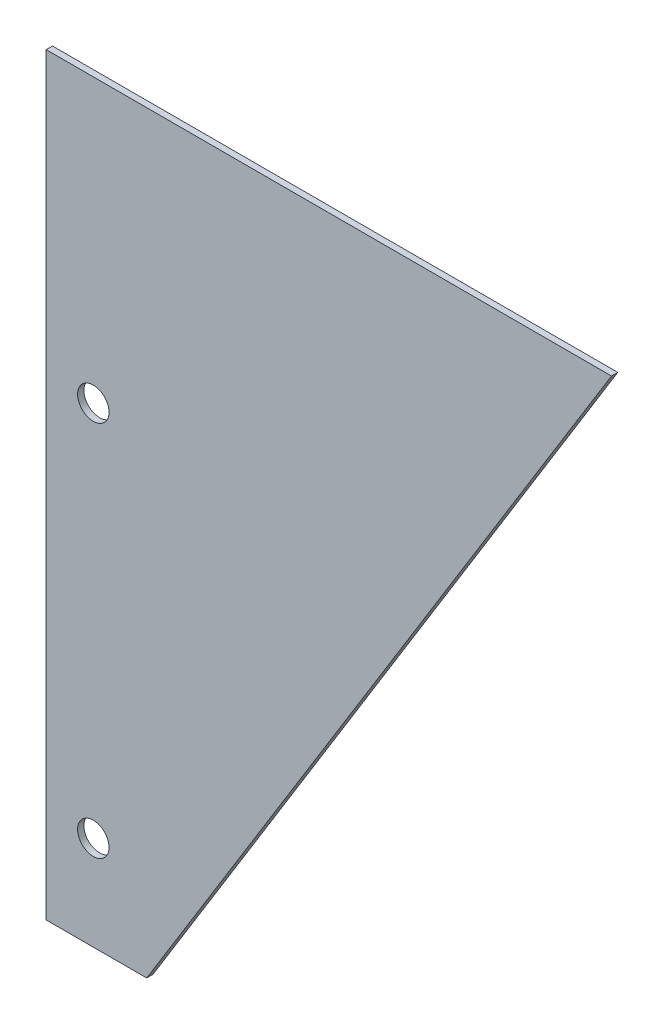
ISO-10303-21;
HEADER;
FILE_DESCRIPTION(('STEP AP214'),'2;1');
FILE_NAME('part.step','',(''),(''),'','','');
FILE_SCHEMA(('AUTOMOTIVE_DESIGN { 1 0 10303 214 1 1 1 1 }'));
ENDSEC;
DATA;
#1=APPLICATION_CONTEXT('core data for automotive mechanical design processes');
#2=APPLICATION_PROTOCOL_DEFINITION('international standard','automotive_design',2000,#1);
#3=PRODUCT_CONTEXT('',#1,'mechanical');
#4=PRODUCT('Part','Part','',(#3));
#5=PRODUCT_RELATED_PRODUCT_CATEGORY('part','',(#4));
#6=PRODUCT_DEFINITION_FORMATION('','',#4);
#7=PRODUCT_DEFINITION_CONTEXT('part definition',#1,'design');
#8=PRODUCT_DEFINITION('design','',#6,#7);
#9=PRODUCT_DEFINITION_SHAPE('','',#8);
#10=(LENGTH_UNIT() NAMED_UNIT(*) SI_UNIT(.MILLI.,.METRE.));
#11=(NAMED_UNIT(*) PLANE_ANGLE_UNIT() SI_UNIT($,.RADIAN.));
#12=(NAMED_UNIT(*) SI_UNIT($,.STERADIAN.) SOLID_ANGLE_UNIT());
#13=UNCERTAINTY_MEASURE_WITH_UNIT(LENGTH_MEASURE(1.E-05),#10,'distance_accuracy_value','');
#14=(GEOMETRIC_REPRESENTATION_CONTEXT(3) GLOBAL_UNCERTAINTY_ASSIGNED_CONTEXT((#13)) GLOBAL_UNIT_ASSIGNED_CONTEXT((#10,
#11,#12)) REPRESENTATION_CONTEXT('',''));
#15=CARTESIAN_POINT('',(0.,0.,0.));
#16=DIRECTION('',(0.,0.,1.));
#17=DIRECTION('',(1.,0.,0.));
#18=AXIS2_PLACEMENT_3D('',#15,#16,#17);
#19=CARTESIAN_POINT('',(0.,0.,1.));
#20=DIRECTION('',(0.,0.,1.));
#21=DIRECTION('',(1.,0.,0.));
#22=AXIS2_PLACEMENT_3D('',#19,#20,#21);
#23=PLANE('',#22);
#24=CARTESIAN_POINT('',(7.50000000000001,75.,1.));
#25=DIRECTION('',(0.,0.,-1.));
#26=DIRECTION('',(-1.,0.,0.));
#27=AXIS2_PLACEMENT_3D('',#24,#25,#26);
#28=CIRCLE('',#27,2.5);
#29=CARTESIAN_POINT('',(5.,75.,1.));
#30=VERTEX_POINT('',#29);
#31=EDGE_CURVE('E82',#30,#30,#28,.T.);
#32=ORIENTED_EDGE('',*,*,#31,.T.);
#33=EDGE_LOOP('',(#32));
#34=FACE_BOUND('',#33,.T.);
#35=DIRECTION('',(-0.524888702996461,-0.85117086972399,0.));
#36=VECTOR('',#35,1.);
#37=CARTESIAN_POINT('',(16.,0.,1.));
#38=LINE('',#37,#36);
#39=CARTESIAN_POINT('',(16.,0.,1.));
#40=VERTEX_POINT('',#39);
#41=CARTESIAN_POINT('',(90.,120.,1.));
#42=VERTEX_POINT('',#41);
#43=EDGE_CURVE('E55',#40,#42,#38,.F.);
#44=ORIENTED_EDGE('',*,*,#43,.T.);
#45=DIRECTION('',(1.,0.,0.));
#46=VECTOR('',#45,1.);
#47=CARTESIAN_POINT('',(90.,120.,1.));
#48=LINE('',#47,#46);
#49=CARTESIAN_POINT('',(0.,120.,1.));
#50=VERTEX_POINT('',#49);
#51=EDGE_CURVE('E96',#42,#50,#48,.F.);
#52=ORIENTED_EDGE('',*,*,#51,.T.);
#53=DIRECTION('',(0.,1.,0.));
#54=VECTOR('',#53,1.);
#55=CARTESIAN_POINT('',(0.,120.,1.));
#56=LINE('',#55,#54);
#57=CARTESIAN_POINT('',(0.,0.,1.));
#58=VERTEX_POINT('',#57);
#59=EDGE_CURVE('E60',#50,#58,#56,.F.);
#60=ORIENTED_EDGE('',*,*,#59,.T.);
#61=DIRECTION('',(1.,0.,0.));
#62=VECTOR('',#61,1.);
#63=CARTESIAN_POINT('',(0.,0.,1.));
#64=LINE('',#63,#62);
#65=EDGE_CURVE('E58',#58,#40,#64,.T.);
#66=ORIENTED_EDGE('',*,*,#65,.T.);
#67=EDGE_LOOP('',(#44,#52,#60,#66));
#68=FACE_BOUND('',#67,.T.);
#69=CARTESIAN_POINT('',(7.50000000000001,15.,1.));
#70=DIRECTION('',(0.,0.,-1.));
#71=DIRECTION('',(-1.,0.,0.));
#72=AXIS2_PLACEMENT_3D('',#69,#70,#71);
#73=CIRCLE('',#72,2.5);
#74=CARTESIAN_POINT('',(5.,15.,1.));
#75=VERTEX_POINT('',#74);
#76=EDGE_CURVE('E19',#75,#75,#73,.T.);
#77=ORIENTED_EDGE('',*,*,#76,.T.);
#78=EDGE_LOOP('',(#77));
#79=FACE_BOUND('',#78,.T.);
#80=ADVANCED_FACE('F16',(#34,#68,#79),#23,.T.);
#81=CARTESIAN_POINT('',(0.,0.,1.));
#82=DIRECTION('',(0.,1.,0.));
#83=DIRECTION('',(0.,0.,1.));
#84=AXIS2_PLACEMENT_3D('',#81,#82,#83);
#85=PLANE('',#84);
#86=DIRECTION('',(0.,0.,1.));
#87=VECTOR('',#86,1.);
#88=CARTESIAN_POINT('',(16.,0.,1.));
#89=LINE('',#88,#87);
#90=CARTESIAN_POINT('',(16.,0.,0.));
#91=VERTEX_POINT('',#90);
#92=EDGE_CURVE('E65',#91,#40,#89,.T.);
#93=ORIENTED_EDGE('',*,*,#92,.T.);
#94=ORIENTED_EDGE('',*,*,#65,.F.);
#95=DIRECTION('',(0.,0.,1.));
#96=VECTOR('',#95,1.);
#97=CARTESIAN_POINT('',(0.,0.,1.));
#98=LINE('',#97,#96);
#99=CARTESIAN_POINT('',(0.,0.,0.));
#100=VERTEX_POINT('',#99);
#101=EDGE_CURVE('E89',#58,#100,#98,.F.);
#102=ORIENTED_EDGE('',*,*,#101,.T.);
#103=DIRECTION('',(1.,0.,0.));
#104=VECTOR('',#103,1.);
#105=CARTESIAN_POINT('',(0.,0.,0.));
#106=LINE('',#105,#104);
#107=EDGE_CURVE('E76',#100,#91,#106,.T.);
#108=ORIENTED_EDGE('',*,*,#107,.T.);
#109=EDGE_LOOP('',(#93,#94,#102,#108));
#110=FACE_BOUND('',#109,.T.);
#111=ADVANCED_FACE('F75',(#110),#85,.F.);
#112=CARTESIAN_POINT('',(16.,0.,1.));
#113=DIRECTION('',(-0.85117086972399,0.524888702996461,0.));
#114=DIRECTION('',(-0.524888702996461,-0.85117086972399,0.));
#115=AXIS2_PLACEMENT_3D('',#112,#113,#114);
#116=PLANE('',#115);
#117=DIRECTION('',(0.,0.,-1.));
#118=VECTOR('',#117,1.);
#119=CARTESIAN_POINT('',(90.,120.,1.));
#120=LINE('',#119,#118);
#121=CARTESIAN_POINT('',(90.,120.,0.));
#122=VERTEX_POINT('',#121);
#123=EDGE_CURVE('E72',#122,#42,#120,.F.);
#124=ORIENTED_EDGE('',*,*,#123,.T.);
#125=ORIENTED_EDGE('',*,*,#43,.F.);
#126=ORIENTED_EDGE('',*,*,#92,.F.);
#127=DIRECTION('',(0.524888702996461,0.85117086972399,0.));
#128=VECTOR('',#127,1.);
#129=CARTESIAN_POINT('',(16.,0.,0.));
#130=LINE('',#129,#128);
#131=EDGE_CURVE('E86',#91,#122,#130,.T.);
#132=ORIENTED_EDGE('',*,*,#131,.T.);
#133=EDGE_LOOP('',(#124,#125,#126,#132));
#134=FACE_BOUND('',#133,.T.);
#135=ADVANCED_FACE('F69',(#134),#116,.F.);
#136=CARTESIAN_POINT('',(90.,120.,1.));
#137=DIRECTION('',(0.,-1.,0.));
#138=DIRECTION('',(0.,0.,-1.));
#139=AXIS2_PLACEMENT_3D('',#136,#137,#138);
#140=PLANE('',#139);
#141=DIRECTION('',(0.,0.,1.));
#142=VECTOR('',#141,1.);
#143=CARTESIAN_POINT('',(0.,120.,1.));
#144=LINE('',#143,#142);
#145=CARTESIAN_POINT('',(0.,120.,0.));
#146=VERTEX_POINT('',#145);
#147=EDGE_CURVE('E34',#146,#50,#144,.T.);
#148=ORIENTED_EDGE('',*,*,#147,.T.);
#149=ORIENTED_EDGE('',*,*,#51,.F.);
#150=ORIENTED_EDGE('',*,*,#123,.F.);
#151=DIRECTION('',(1.,0.,0.));
#152=VECTOR('',#151,1.);
#153=CARTESIAN_POINT('',(0.,120.,0.));
#154=LINE('',#153,#152);
#155=EDGE_CURVE('E102',#122,#146,#154,.F.);
#156=ORIENTED_EDGE('',*,*,#155,.T.);
#157=EDGE_LOOP('',(#148,#149,#150,#156));
#158=FACE_BOUND('',#157,.T.);
#159=ADVANCED_FACE('F100',(#158),#140,.F.);
#160=CARTESIAN_POINT('',(0.,120.,1.));
#161=DIRECTION('',(1.,0.,0.));
#162=DIRECTION('',(0.,1.,0.));
#163=AXIS2_PLACEMENT_3D('',#160,#161,#162);
#164=PLANE('',#163);
#165=ORIENTED_EDGE('',*,*,#101,.F.);
#166=ORIENTED_EDGE('',*,*,#59,.F.);
#167=ORIENTED_EDGE('',*,*,#147,.F.);
#168=DIRECTION('',(0.,1.,0.));
#169=VECTOR('',#168,1.);
#170=CARTESIAN_POINT('',(0.,0.,0.));
#171=LINE('',#170,#169);
#172=EDGE_CURVE('E81',#146,#100,#171,.F.);
#173=ORIENTED_EDGE('',*,*,#172,.T.);
#174=EDGE_LOOP('',(#165,#166,#167,#173));
#175=FACE_BOUND('',#174,.T.);
#176=ADVANCED_FACE('F98',(#175),#164,.F.);
#177=CARTESIAN_POINT('',(7.50000000000001,15.,1.));
#178=DIRECTION('',(0.,0.,-1.));
#179=DIRECTION('',(-1.,0.,0.));
#180=AXIS2_PLACEMENT_3D('',#177,#178,#179);
#181=CYLINDRICAL_SURFACE('',#180,2.5);
#182=CARTESIAN_POINT('',(7.50000000000001,15.,0.));
#183=DIRECTION('',(0.,0.,-1.));
#184=DIRECTION('',(-1.,0.,0.));
#185=AXIS2_PLACEMENT_3D('',#182,#183,#184);
#186=CIRCLE('',#185,2.5);
#187=CARTESIAN_POINT('',(5.,15.,0.));
#188=VERTEX_POINT('',#187);
#189=EDGE_CURVE('E25',#188,#188,#186,.T.);
#190=ORIENTED_EDGE('',*,*,#189,.T.);
#191=EDGE_LOOP('',(#190));
#192=FACE_BOUND('',#191,.T.);
#193=ORIENTED_EDGE('',*,*,#76,.F.);
#194=EDGE_LOOP('',(#193));
#195=FACE_BOUND('',#194,.T.);
#196=ADVANCED_FACE('F115',(#192,#195),#181,.F.);
#197=CARTESIAN_POINT('',(7.50000000000001,75.,1.));
#198=DIRECTION('',(0.,0.,-1.));
#199=DIRECTION('',(-1.,0.,0.));
#200=AXIS2_PLACEMENT_3D('',#197,#198,#199);
#201=CYLINDRICAL_SURFACE('',#200,2.5);
#202=CARTESIAN_POINT('',(7.50000000000001,75.,0.));
#203=DIRECTION('',(0.,0.,-1.));
#204=DIRECTION('',(-1.,0.,0.));
#205=AXIS2_PLACEMENT_3D('',#202,#203,#204);
#206=CIRCLE('',#205,2.5);
#207=CARTESIAN_POINT('',(5.,75.,0.));
#208=VERTEX_POINT('',#207);
#209=EDGE_CURVE('E11',#208,#208,#206,.T.);
#210=ORIENTED_EDGE('',*,*,#209,.T.);
#211=EDGE_LOOP('',(#210));
#212=FACE_BOUND('',#211,.T.);
#213=ORIENTED_EDGE('',*,*,#31,.F.);
#214=EDGE_LOOP('',(#213));
#215=FACE_BOUND('',#214,.T.);
#216=ADVANCED_FACE('F108',(#212,#215),#201,.F.);
#217=CARTESIAN_POINT('',(0.,0.,0.));
#218=DIRECTION('',(0.,0.,1.));
#219=DIRECTION('',(1.,0.,0.));
#220=AXIS2_PLACEMENT_3D('',#217,#218,#219);
#221=PLANE('',#220);
#222=ORIENTED_EDGE('',*,*,#209,.F.);
#223=EDGE_LOOP('',(#222));
#224=FACE_BOUND('',#223,.T.);
#225=ORIENTED_EDGE('',*,*,#189,.F.);
#226=EDGE_LOOP('',(#225));
#227=FACE_BOUND('',#226,.T.);
#228=ORIENTED_EDGE('',*,*,#155,.F.);
#229=ORIENTED_EDGE('',*,*,#131,.F.);
#230=ORIENTED_EDGE('',*,*,#107,.F.);
#231=ORIENTED_EDGE('',*,*,#172,.F.);
#232=EDGE_LOOP('',(#228,#229,#230,#231));
#233=FACE_BOUND('',#232,.T.);
#234=ADVANCED_FACE('F106',(#224,#227,#233),#221,.F.);
#235=CLOSED_SHELL('',(#80,#111,#135,#159,#176,#196,#216,#234));
#236=MANIFOLD_SOLID_BREP('B1',#235);
#237=ADVANCED_BREP_SHAPE_REPRESENTATION('',(#18,#236),#14);
#238=SHAPE_DEFINITION_REPRESENTATION(#9,#237);
ENDSEC;
END-ISO-10303-21;
